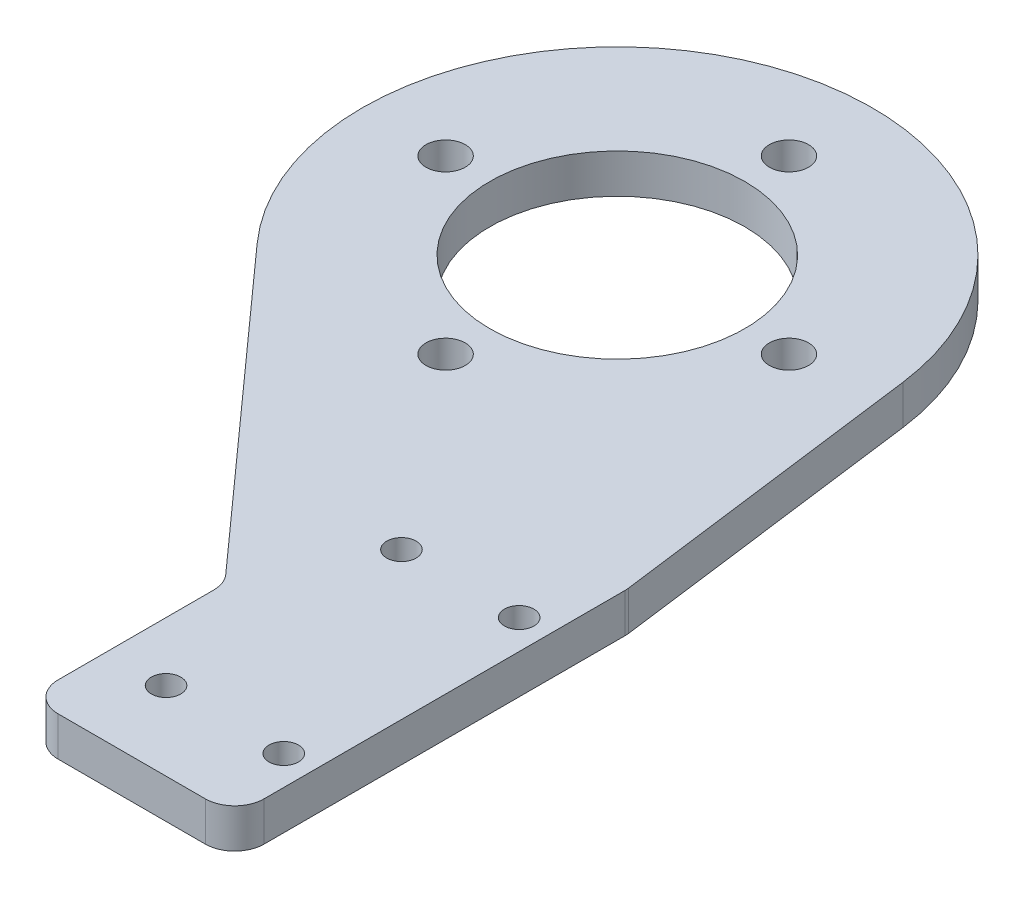
ISO-10303-21;
HEADER;
FILE_DESCRIPTION(('STEP AP214'),'2;1');
FILE_NAME('part.step','',(''),(''),'','','');
FILE_SCHEMA(('AUTOMOTIVE_DESIGN { 1 0 10303 214 1 1 1 1 }'));
ENDSEC;
DATA;
#1=APPLICATION_CONTEXT('core data for automotive mechanical design processes');
#2=APPLICATION_PROTOCOL_DEFINITION('international standard','automotive_design',2000,#1);
#3=PRODUCT_CONTEXT('',#1,'mechanical');
#4=PRODUCT('Part','Part','',(#3));
#5=PRODUCT_RELATED_PRODUCT_CATEGORY('part','',(#4));
#6=PRODUCT_DEFINITION_FORMATION('','',#4);
#7=PRODUCT_DEFINITION_CONTEXT('part definition',#1,'design');
#8=PRODUCT_DEFINITION('design','',#6,#7);
#9=PRODUCT_DEFINITION_SHAPE('','',#8);
#10=(LENGTH_UNIT() NAMED_UNIT(*) SI_UNIT(.MILLI.,.METRE.));
#11=(NAMED_UNIT(*) PLANE_ANGLE_UNIT() SI_UNIT($,.RADIAN.));
#12=(NAMED_UNIT(*) SI_UNIT($,.STERADIAN.) SOLID_ANGLE_UNIT());
#13=UNCERTAINTY_MEASURE_WITH_UNIT(LENGTH_MEASURE(1.E-05),#10,'distance_accuracy_value','');
#14=(GEOMETRIC_REPRESENTATION_CONTEXT(3) GLOBAL_UNCERTAINTY_ASSIGNED_CONTEXT((#13)) GLOBAL_UNIT_ASSIGNED_CONTEXT((#10,
#11,#12)) REPRESENTATION_CONTEXT('',''));
#15=CARTESIAN_POINT('',(0.,0.,0.));
#16=DIRECTION('',(0.,0.,1.));
#17=DIRECTION('',(1.,0.,0.));
#18=AXIS2_PLACEMENT_3D('',#15,#16,#17);
#19=CARTESIAN_POINT('',(-30.,4.,-69.));
#20=DIRECTION('',(0.,-1.,0.));
#21=DIRECTION('',(0.,0.,-1.));
#22=AXIS2_PLACEMENT_3D('',#19,#20,#21);
#23=CYLINDRICAL_SURFACE('',#22,26.);
#24=CARTESIAN_POINT('',(-30.,0.,-69.));
#25=DIRECTION('',(0.,1.,0.));
#26=DIRECTION('',(0.,0.,1.));
#27=AXIS2_PLACEMENT_3D('',#24,#25,#26);
#28=CIRCLE('',#27,26.);
#29=CARTESIAN_POINT('',(-4.21809841522244,0.,-72.3605878463216));
#30=VERTEX_POINT('',#29);
#31=CARTESIAN_POINT('',(-49.3623097548395,0.,-51.6477390246213));
#32=VERTEX_POINT('',#31);
#33=EDGE_CURVE('E148',#30,#32,#28,.T.);
#34=ORIENTED_EDGE('',*,*,#33,.T.);
#35=DIRECTION('',(0.,-1.,0.));
#36=VECTOR('',#35,1.);
#37=CARTESIAN_POINT('',(-49.3623097548395,4.,-51.6477390246213));
#38=LINE('',#37,#36);
#39=CARTESIAN_POINT('',(-49.3623097548395,4.,-51.6477390246213));
#40=VERTEX_POINT('',#39);
#41=EDGE_CURVE('E127',#40,#32,#38,.T.);
#42=ORIENTED_EDGE('',*,*,#41,.F.);
#43=CARTESIAN_POINT('',(-30.,4.,-69.));
#44=DIRECTION('',(0.,1.,0.));
#45=DIRECTION('',(0.,0.,1.));
#46=AXIS2_PLACEMENT_3D('',#43,#44,#45);
#47=CIRCLE('',#46,26.);
#48=CARTESIAN_POINT('',(-4.21809841522244,4.,-72.3605878463216));
#49=VERTEX_POINT('',#48);
#50=EDGE_CURVE('E135',#49,#40,#47,.T.);
#51=ORIENTED_EDGE('',*,*,#50,.F.);
#52=DIRECTION('',(0.,-1.,0.));
#53=VECTOR('',#52,1.);
#54=CARTESIAN_POINT('',(-4.21809841522244,4.,-72.3605878463216));
#55=LINE('',#54,#53);
#56=EDGE_CURVE('E146',#49,#30,#55,.T.);
#57=ORIENTED_EDGE('',*,*,#56,.T.);
#58=EDGE_LOOP('',(#34,#42,#51,#57));
#59=FACE_BOUND('',#58,.T.);
#60=ADVANCED_FACE('F43',(#59),#23,.T.);
#61=CARTESIAN_POINT('',(-1.70603961663828,4.,1.52893146722039));
#62=DIRECTION('',(-0.744704221339978,0.,0.66739465289918));
#63=DIRECTION('',(0.66739465289918,0.,0.744704221339978));
#64=AXIS2_PLACEMENT_3D('',#61,#62,#63);
#65=PLANE('',#64);
#66=DIRECTION('',(-0.66739465289918,0.,-0.744704221339978));
#67=VECTOR('',#66,1.);
#68=CARTESIAN_POINT('',(-1.70603961663828,0.,1.52893146722039));
#69=LINE('',#68,#67);
#70=CARTESIAN_POINT('',(-21.7658873359801,0.,-20.8546060860655));
#71=VERTEX_POINT('',#70);
#72=EDGE_CURVE('E188',#71,#32,#69,.T.);
#73=ORIENTED_EDGE('',*,*,#72,.F.);
#74=DIRECTION('',(0.,-1.,0.));
#75=VECTOR('',#74,1.);
#76=CARTESIAN_POINT('',(-21.7658873359801,4.,-20.8546060860655));
#77=LINE('',#76,#75);
#78=CARTESIAN_POINT('',(-21.7658873359801,4.,-20.8546060860655));
#79=VERTEX_POINT('',#78);
#80=EDGE_CURVE('E129',#71,#79,#77,.F.);
#81=ORIENTED_EDGE('',*,*,#80,.T.);
#82=DIRECTION('',(-0.66739465289918,0.,-0.744704221339978));
#83=VECTOR('',#82,1.);
#84=CARTESIAN_POINT('',(-1.70603961663828,4.,1.52893146722039));
#85=LINE('',#84,#83);
#86=EDGE_CURVE('E121',#79,#40,#85,.T.);
#87=ORIENTED_EDGE('',*,*,#86,.T.);
#88=ORIENTED_EDGE('',*,*,#41,.T.);
#89=EDGE_LOOP('',(#73,#81,#87,#88));
#90=FACE_BOUND('',#89,.T.);
#91=ADVANCED_FACE('F123',(#90),#65,.T.);
#92=CARTESIAN_POINT('',(-21.,4.,0.));
#93=DIRECTION('',(-1.,0.,0.));
#94=DIRECTION('',(0.,0.,1.));
#95=AXIS2_PLACEMENT_3D('',#92,#93,#94);
#96=PLANE('',#95);
#97=DIRECTION('',(0.,0.,-1.));
#98=VECTOR('',#97,1.);
#99=CARTESIAN_POINT('',(-21.,0.,0.));
#100=LINE('',#99,#98);
#101=CARTESIAN_POINT('',(-21.,0.,-3.));
#102=VERTEX_POINT('',#101);
#103=CARTESIAN_POINT('',(-21.,0.,-18.8524221273679));
#104=VERTEX_POINT('',#103);
#105=EDGE_CURVE('E186',#102,#104,#100,.T.);
#106=ORIENTED_EDGE('',*,*,#105,.F.);
#107=DIRECTION('',(0.,-1.,0.));
#108=VECTOR('',#107,1.);
#109=CARTESIAN_POINT('',(-21.,4.,-3.));
#110=LINE('',#109,#108);
#111=CARTESIAN_POINT('',(-21.,4.,-3.));
#112=VERTEX_POINT('',#111);
#113=EDGE_CURVE('E178',#102,#112,#110,.F.);
#114=ORIENTED_EDGE('',*,*,#113,.T.);
#115=DIRECTION('',(0.,0.,-1.));
#116=VECTOR('',#115,1.);
#117=CARTESIAN_POINT('',(-21.,4.,0.));
#118=LINE('',#117,#116);
#119=CARTESIAN_POINT('',(-21.,4.,-18.8524221273679));
#120=VERTEX_POINT('',#119);
#121=EDGE_CURVE('E133',#112,#120,#118,.T.);
#122=ORIENTED_EDGE('',*,*,#121,.T.);
#123=DIRECTION('',(0.,-1.,0.));
#124=VECTOR('',#123,1.);
#125=CARTESIAN_POINT('',(-21.,0.,-18.8524221273679));
#126=LINE('',#125,#124);
#127=EDGE_CURVE('E176',#120,#104,#126,.T.);
#128=ORIENTED_EDGE('',*,*,#127,.T.);
#129=EDGE_LOOP('',(#106,#114,#122,#128));
#130=FACE_BOUND('',#129,.T.);
#131=ADVANCED_FACE('F193',(#130),#96,.T.);
#132=CARTESIAN_POINT('',(0.,4.,0.));
#133=DIRECTION('',(0.,0.,1.));
#134=DIRECTION('',(1.,0.,0.));
#135=AXIS2_PLACEMENT_3D('',#132,#133,#134);
#136=PLANE('',#135);
#137=DIRECTION('',(-1.,0.,0.));
#138=VECTOR('',#137,1.);
#139=CARTESIAN_POINT('',(0.,0.,0.));
#140=LINE('',#139,#138);
#141=CARTESIAN_POINT('',(-3.,0.,0.));
#142=VERTEX_POINT('',#141);
#143=CARTESIAN_POINT('',(-18.,0.,0.));
#144=VERTEX_POINT('',#143);
#145=EDGE_CURVE('E220',#142,#144,#140,.T.);
#146=ORIENTED_EDGE('',*,*,#145,.F.);
#147=DIRECTION('',(0.,-1.,0.));
#148=VECTOR('',#147,1.);
#149=CARTESIAN_POINT('',(-3.,4.,0.));
#150=LINE('',#149,#148);
#151=CARTESIAN_POINT('',(-3.,4.,0.));
#152=VERTEX_POINT('',#151);
#153=EDGE_CURVE('E62',#142,#152,#150,.F.);
#154=ORIENTED_EDGE('',*,*,#153,.T.);
#155=DIRECTION('',(-1.,0.,0.));
#156=VECTOR('',#155,1.);
#157=CARTESIAN_POINT('',(0.,4.,0.));
#158=LINE('',#157,#156);
#159=CARTESIAN_POINT('',(-18.,4.,0.));
#160=VERTEX_POINT('',#159);
#161=EDGE_CURVE('E198',#152,#160,#158,.T.);
#162=ORIENTED_EDGE('',*,*,#161,.T.);
#163=DIRECTION('',(0.,-1.,0.));
#164=VECTOR('',#163,1.);
#165=CARTESIAN_POINT('',(-18.,4.,0.));
#166=LINE('',#165,#164);
#167=EDGE_CURVE('E175',#160,#144,#166,.T.);
#168=ORIENTED_EDGE('',*,*,#167,.T.);
#169=EDGE_LOOP('',(#146,#154,#162,#168));
#170=FACE_BOUND('',#169,.T.);
#171=ADVANCED_FACE('F276',(#170),#136,.T.);
#172=CARTESIAN_POINT('',(0.,4.,0.));
#173=DIRECTION('',(-1.,0.,0.));
#174=DIRECTION('',(0.,0.,1.));
#175=AXIS2_PLACEMENT_3D('',#172,#173,#174);
#176=PLANE('',#175);
#177=DIRECTION('',(0.,0.,-1.));
#178=VECTOR('',#177,1.);
#179=CARTESIAN_POINT('',(0.,0.,0.));
#180=LINE('',#179,#178);
#181=CARTESIAN_POINT('',(0.,0.,-3.));
#182=VERTEX_POINT('',#181);
#183=CARTESIAN_POINT('',(0.,0.,-39.8053033351342));
#184=VERTEX_POINT('',#183);
#185=EDGE_CURVE('E219',#182,#184,#180,.T.);
#186=ORIENTED_EDGE('',*,*,#185,.T.);
#187=DIRECTION('',(0.,-1.,0.));
#188=VECTOR('',#187,1.);
#189=CARTESIAN_POINT('',(0.,4.,-39.8053033351342));
#190=LINE('',#189,#188);
#191=CARTESIAN_POINT('',(0.,4.,-39.8053033351342));
#192=VERTEX_POINT('',#191);
#193=EDGE_CURVE('E164',#184,#192,#190,.F.);
#194=ORIENTED_EDGE('',*,*,#193,.T.);
#195=DIRECTION('',(0.,0.,-1.));
#196=VECTOR('',#195,1.);
#197=CARTESIAN_POINT('',(0.,4.,0.));
#198=LINE('',#197,#196);
#199=CARTESIAN_POINT('',(0.,4.,-3.));
#200=VERTEX_POINT('',#199);
#201=EDGE_CURVE('E196',#200,#192,#198,.T.);
#202=ORIENTED_EDGE('',*,*,#201,.F.);
#203=DIRECTION('',(0.,-1.,0.));
#204=VECTOR('',#203,1.);
#205=CARTESIAN_POINT('',(0.,0.,-3.));
#206=LINE('',#205,#204);
#207=EDGE_CURVE('E165',#200,#182,#206,.T.);
#208=ORIENTED_EDGE('',*,*,#207,.T.);
#209=EDGE_LOOP('',(#186,#194,#202,#208));
#210=FACE_BOUND('',#209,.T.);
#211=ADVANCED_FACE('F282',(#210),#176,.F.);
#212=CARTESIAN_POINT('',(-3.,4.,-32.));
#213=DIRECTION('',(0.,-1.,0.));
#214=DIRECTION('',(0.,0.,-1.));
#215=AXIS2_PLACEMENT_3D('',#212,#213,#214);
#216=CYLINDRICAL_SURFACE('',#215,1.5);
#217=CARTESIAN_POINT('',(-3.,4.,-32.));
#218=DIRECTION('',(0.,1.,0.));
#219=DIRECTION('',(0.,0.,1.));
#220=AXIS2_PLACEMENT_3D('',#217,#218,#219);
#221=CIRCLE('',#220,1.5);
#222=CARTESIAN_POINT('',(-3.,4.,-30.5));
#223=VERTEX_POINT('',#222);
#224=EDGE_CURVE('E207',#223,#223,#221,.T.);
#225=ORIENTED_EDGE('',*,*,#224,.T.);
#226=EDGE_LOOP('',(#225));
#227=FACE_BOUND('',#226,.T.);
#228=CARTESIAN_POINT('',(-3.,0.,-32.));
#229=DIRECTION('',(0.,1.,0.));
#230=DIRECTION('',(0.,0.,1.));
#231=AXIS2_PLACEMENT_3D('',#228,#229,#230);
#232=CIRCLE('',#231,1.5);
#233=CARTESIAN_POINT('',(-3.,0.,-30.5));
#234=VERTEX_POINT('',#233);
#235=EDGE_CURVE('E231',#234,#234,#232,.T.);
#236=ORIENTED_EDGE('',*,*,#235,.F.);
#237=EDGE_LOOP('',(#236));
#238=FACE_BOUND('',#237,.T.);
#239=ADVANCED_FACE('F289',(#227,#238),#216,.F.);
#240=CARTESIAN_POINT('',(-2.99999999999975,4.,-8.));
#241=DIRECTION('',(0.,-1.,0.));
#242=DIRECTION('',(0.,0.,-1.));
#243=AXIS2_PLACEMENT_3D('',#240,#241,#242);
#244=CYLINDRICAL_SURFACE('',#243,1.5);
#245=CARTESIAN_POINT('',(-2.99999999999975,4.,-8.));
#246=DIRECTION('',(0.,1.,0.));
#247=DIRECTION('',(0.,0.,1.));
#248=AXIS2_PLACEMENT_3D('',#245,#246,#247);
#249=CIRCLE('',#248,1.5);
#250=CARTESIAN_POINT('',(-2.99999999999975,4.,-6.5));
#251=VERTEX_POINT('',#250);
#252=EDGE_CURVE('E206',#251,#251,#249,.T.);
#253=ORIENTED_EDGE('',*,*,#252,.T.);
#254=EDGE_LOOP('',(#253));
#255=FACE_BOUND('',#254,.T.);
#256=CARTESIAN_POINT('',(-2.99999999999975,0.,-8.));
#257=DIRECTION('',(0.,1.,0.));
#258=DIRECTION('',(0.,0.,1.));
#259=AXIS2_PLACEMENT_3D('',#256,#257,#258);
#260=CIRCLE('',#259,1.5);
#261=CARTESIAN_POINT('',(-2.99999999999975,0.,-6.5));
#262=VERTEX_POINT('',#261);
#263=EDGE_CURVE('E226',#262,#262,#260,.T.);
#264=ORIENTED_EDGE('',*,*,#263,.F.);
#265=EDGE_LOOP('',(#264));
#266=FACE_BOUND('',#265,.T.);
#267=ADVANCED_FACE('F293',(#255,#266),#244,.F.);
#268=CARTESIAN_POINT('',(-14.9999999999997,4.,-8.));
#269=DIRECTION('',(0.,-1.,0.));
#270=DIRECTION('',(0.,0.,-1.));
#271=AXIS2_PLACEMENT_3D('',#268,#269,#270);
#272=CYLINDRICAL_SURFACE('',#271,1.5);
#273=CARTESIAN_POINT('',(-14.9999999999997,4.,-8.));
#274=DIRECTION('',(0.,1.,0.));
#275=DIRECTION('',(0.,0.,1.));
#276=AXIS2_PLACEMENT_3D('',#273,#274,#275);
#277=CIRCLE('',#276,1.5);
#278=CARTESIAN_POINT('',(-14.9999999999997,4.,-6.5));
#279=VERTEX_POINT('',#278);
#280=EDGE_CURVE('E201',#279,#279,#277,.T.);
#281=ORIENTED_EDGE('',*,*,#280,.T.);
#282=EDGE_LOOP('',(#281));
#283=FACE_BOUND('',#282,.T.);
#284=CARTESIAN_POINT('',(-14.9999999999997,0.,-8.));
#285=DIRECTION('',(0.,1.,0.));
#286=DIRECTION('',(0.,0.,1.));
#287=AXIS2_PLACEMENT_3D('',#284,#285,#286);
#288=CIRCLE('',#287,1.5);
#289=CARTESIAN_POINT('',(-14.9999999999997,0.,-6.5));
#290=VERTEX_POINT('',#289);
#291=EDGE_CURVE('E223',#290,#290,#288,.T.);
#292=ORIENTED_EDGE('',*,*,#291,.F.);
#293=EDGE_LOOP('',(#292));
#294=FACE_BOUND('',#293,.T.);
#295=ADVANCED_FACE('F249',(#283,#294),#272,.F.);
#296=CARTESIAN_POINT('',(5.12676598348304,4.,-0.668257436262989));
#297=DIRECTION('',(-0.991611599414522,0.,0.129253378704677));
#298=DIRECTION('',(0.129253378704677,0.,0.991611599414521));
#299=AXIS2_PLACEMENT_3D('',#296,#297,#298);
#300=PLANE('',#299);
#301=DIRECTION('',(-0.129253378704677,0.,-0.991611599414522));
#302=VECTOR('',#301,1.);
#303=CARTESIAN_POINT('',(5.12676598348304,4.,-0.668257436262989));
#304=LINE('',#303,#302);
#305=CARTESIAN_POINT('',(-0.0251652017564368,4.,-40.1930634712483));
#306=VERTEX_POINT('',#305);
#307=EDGE_CURVE('E138',#306,#49,#304,.T.);
#308=ORIENTED_EDGE('',*,*,#307,.F.);
#309=DIRECTION('',(0.,-1.,0.));
#310=VECTOR('',#309,1.);
#311=CARTESIAN_POINT('',(-0.0251652017564351,4.,-40.1930634712482));
#312=LINE('',#311,#310);
#313=CARTESIAN_POINT('',(-0.0251652017564368,0.,-40.1930634712483));
#314=VERTEX_POINT('',#313);
#315=EDGE_CURVE('E150',#306,#314,#312,.T.);
#316=ORIENTED_EDGE('',*,*,#315,.T.);
#317=DIRECTION('',(-0.129253378704677,0.,-0.991611599414522));
#318=VECTOR('',#317,1.);
#319=CARTESIAN_POINT('',(5.12676598348304,0.,-0.668257436262989));
#320=LINE('',#319,#318);
#321=EDGE_CURVE('E224',#314,#30,#320,.T.);
#322=ORIENTED_EDGE('',*,*,#321,.T.);
#323=ORIENTED_EDGE('',*,*,#56,.F.);
#324=EDGE_LOOP('',(#308,#316,#322,#323));
#325=FACE_BOUND('',#324,.T.);
#326=ADVANCED_FACE('F238',(#325),#300,.F.);
#327=CARTESIAN_POINT('',(-15.,4.,-32.));
#328=DIRECTION('',(0.,-1.,0.));
#329=DIRECTION('',(0.,0.,-1.));
#330=AXIS2_PLACEMENT_3D('',#327,#328,#329);
#331=CYLINDRICAL_SURFACE('',#330,1.5);
#332=CARTESIAN_POINT('',(-15.,4.,-32.));
#333=DIRECTION('',(0.,1.,0.));
#334=DIRECTION('',(0.,0.,1.));
#335=AXIS2_PLACEMENT_3D('',#332,#333,#334);
#336=CIRCLE('',#335,1.5);
#337=CARTESIAN_POINT('',(-15.,4.,-30.5));
#338=VERTEX_POINT('',#337);
#339=EDGE_CURVE('E153',#338,#338,#336,.T.);
#340=ORIENTED_EDGE('',*,*,#339,.T.);
#341=EDGE_LOOP('',(#340));
#342=FACE_BOUND('',#341,.T.);
#343=CARTESIAN_POINT('',(-15.,0.,-32.));
#344=DIRECTION('',(0.,1.,0.));
#345=DIRECTION('',(0.,0.,1.));
#346=AXIS2_PLACEMENT_3D('',#343,#344,#345);
#347=CIRCLE('',#346,1.5);
#348=CARTESIAN_POINT('',(-15.,0.,-30.5));
#349=VERTEX_POINT('',#348);
#350=EDGE_CURVE('E141',#349,#349,#347,.T.);
#351=ORIENTED_EDGE('',*,*,#350,.F.);
#352=EDGE_LOOP('',(#351));
#353=FACE_BOUND('',#352,.T.);
#354=ADVANCED_FACE('F236',(#342,#353),#331,.F.);
#355=CARTESIAN_POINT('',(0.,4.,0.));
#356=DIRECTION('',(0.,1.,0.));
#357=DIRECTION('',(0.,0.,1.));
#358=AXIS2_PLACEMENT_3D('',#355,#356,#357);
#359=PLANE('',#358);
#360=ORIENTED_EDGE('',*,*,#201,.T.);
#361=CARTESIAN_POINT('',(-3.,4.,-39.8053033351342));
#362=DIRECTION('',(0.,1.,0.));
#363=DIRECTION('',(0.,0.,1.));
#364=AXIS2_PLACEMENT_3D('',#361,#362,#363);
#365=CIRCLE('',#364,3.);
#366=EDGE_CURVE('E168',#192,#306,#365,.T.);
#367=ORIENTED_EDGE('',*,*,#366,.T.);
#368=ORIENTED_EDGE('',*,*,#307,.T.);
#369=ORIENTED_EDGE('',*,*,#50,.T.);
#370=ORIENTED_EDGE('',*,*,#86,.F.);
#371=CARTESIAN_POINT('',(-24.,4.,-18.8524221273679));
#372=DIRECTION('',(0.,1.,0.));
#373=DIRECTION('',(0.,0.,1.));
#374=AXIS2_PLACEMENT_3D('',#371,#372,#373);
#375=CIRCLE('',#374,3.);
#376=EDGE_CURVE('E11',#79,#120,#375,.F.);
#377=ORIENTED_EDGE('',*,*,#376,.T.);
#378=ORIENTED_EDGE('',*,*,#121,.F.);
#379=CARTESIAN_POINT('',(-18.,4.,-3.));
#380=DIRECTION('',(0.,1.,0.));
#381=DIRECTION('',(0.,0.,1.));
#382=AXIS2_PLACEMENT_3D('',#379,#380,#381);
#383=CIRCLE('',#382,3.);
#384=EDGE_CURVE('E59',#112,#160,#383,.T.);
#385=ORIENTED_EDGE('',*,*,#384,.T.);
#386=ORIENTED_EDGE('',*,*,#161,.F.);
#387=CARTESIAN_POINT('',(-3.,4.,-3.));
#388=DIRECTION('',(0.,1.,0.));
#389=DIRECTION('',(0.,0.,1.));
#390=AXIS2_PLACEMENT_3D('',#387,#388,#389);
#391=CIRCLE('',#390,3.);
#392=EDGE_CURVE('E169',#152,#200,#391,.T.);
#393=ORIENTED_EDGE('',*,*,#392,.T.);
#394=EDGE_LOOP('',(#360,#367,#368,#369,#370,#377,#378,#385,#386,#393));
#395=FACE_BOUND('',#394,.T.);
#396=ORIENTED_EDGE('',*,*,#280,.F.);
#397=EDGE_LOOP('',(#396));
#398=FACE_BOUND('',#397,.T.);
#399=ORIENTED_EDGE('',*,*,#252,.F.);
#400=EDGE_LOOP('',(#399));
#401=FACE_BOUND('',#400,.T.);
#402=ORIENTED_EDGE('',*,*,#224,.F.);
#403=EDGE_LOOP('',(#402));
#404=FACE_BOUND('',#403,.T.);
#405=ORIENTED_EDGE('',*,*,#339,.F.);
#406=EDGE_LOOP('',(#405));
#407=FACE_BOUND('',#406,.T.);
#408=CARTESIAN_POINT('',(-29.9999999999998,4.,-86.5));
#409=DIRECTION('',(0.,1.,0.));
#410=DIRECTION('',(0.,0.,1.));
#411=AXIS2_PLACEMENT_3D('',#408,#409,#410);
#412=CIRCLE('',#411,1.99999999999999);
#413=CARTESIAN_POINT('',(-29.9999999999998,4.,-84.5));
#414=VERTEX_POINT('',#413);
#415=EDGE_CURVE('E454',#414,#414,#412,.T.);
#416=ORIENTED_EDGE('',*,*,#415,.F.);
#417=EDGE_LOOP('',(#416));
#418=FACE_BOUND('',#417,.T.);
#419=CARTESIAN_POINT('',(-47.5,4.,-69.0000000000001));
#420=DIRECTION('',(0.,1.,0.));
#421=DIRECTION('',(0.,0.,1.));
#422=AXIS2_PLACEMENT_3D('',#419,#420,#421);
#423=CIRCLE('',#422,1.99999999999999);
#424=CARTESIAN_POINT('',(-47.5,4.,-67.0000000000002));
#425=VERTEX_POINT('',#424);
#426=EDGE_CURVE('E456',#425,#425,#423,.T.);
#427=ORIENTED_EDGE('',*,*,#426,.F.);
#428=EDGE_LOOP('',(#427));
#429=FACE_BOUND('',#428,.T.);
#430=CARTESIAN_POINT('',(-30.0000000000001,4.,-51.5));
#431=DIRECTION('',(0.,1.,0.));
#432=DIRECTION('',(0.,0.,1.));
#433=AXIS2_PLACEMENT_3D('',#430,#431,#432);
#434=CIRCLE('',#433,2.);
#435=CARTESIAN_POINT('',(-30.0000000000001,4.,-49.5));
#436=VERTEX_POINT('',#435);
#437=EDGE_CURVE('E464',#436,#436,#434,.T.);
#438=ORIENTED_EDGE('',*,*,#437,.F.);
#439=EDGE_LOOP('',(#438));
#440=FACE_BOUND('',#439,.T.);
#441=CARTESIAN_POINT('',(-12.5,4.,-69.));
#442=DIRECTION('',(0.,1.,0.));
#443=DIRECTION('',(0.,0.,1.));
#444=AXIS2_PLACEMENT_3D('',#441,#442,#443);
#445=CIRCLE('',#444,2.);
#446=CARTESIAN_POINT('',(-12.5,4.,-67.));
#447=VERTEX_POINT('',#446);
#448=EDGE_CURVE('E469',#447,#447,#445,.T.);
#449=ORIENTED_EDGE('',*,*,#448,.F.);
#450=EDGE_LOOP('',(#449));
#451=FACE_BOUND('',#450,.T.);
#452=CARTESIAN_POINT('',(-30.,4.,-69.));
#453=DIRECTION('',(0.,1.,0.));
#454=DIRECTION('',(0.,0.,1.));
#455=AXIS2_PLACEMENT_3D('',#452,#453,#454);
#456=CIRCLE('',#455,13.);
#457=CARTESIAN_POINT('',(-30.,4.,-56.));
#458=VERTEX_POINT('',#457);
#459=EDGE_CURVE('E478',#458,#458,#456,.T.);
#460=ORIENTED_EDGE('',*,*,#459,.F.);
#461=EDGE_LOOP('',(#460));
#462=FACE_BOUND('',#461,.T.);
#463=ADVANCED_FACE('F136',(#395,#398,#401,#404,#407,#418,#429,#440,#451,#462),#359,.T.);
#464=CARTESIAN_POINT('',(0.,0.,0.));
#465=DIRECTION('',(0.,1.,0.));
#466=DIRECTION('',(0.,0.,1.));
#467=AXIS2_PLACEMENT_3D('',#464,#465,#466);
#468=PLANE('',#467);
#469=ORIENTED_EDGE('',*,*,#321,.F.);
#470=CARTESIAN_POINT('',(-3.,0.,-39.8053033351342));
#471=DIRECTION('',(0.,1.,0.));
#472=DIRECTION('',(0.,0.,1.));
#473=AXIS2_PLACEMENT_3D('',#470,#471,#472);
#474=CIRCLE('',#473,3.);
#475=EDGE_CURVE('E159',#314,#184,#474,.F.);
#476=ORIENTED_EDGE('',*,*,#475,.T.);
#477=ORIENTED_EDGE('',*,*,#185,.F.);
#478=CARTESIAN_POINT('',(-3.,0.,-3.));
#479=DIRECTION('',(0.,1.,0.));
#480=DIRECTION('',(0.,0.,1.));
#481=AXIS2_PLACEMENT_3D('',#478,#479,#480);
#482=CIRCLE('',#481,3.);
#483=EDGE_CURVE('E158',#182,#142,#482,.F.);
#484=ORIENTED_EDGE('',*,*,#483,.T.);
#485=ORIENTED_EDGE('',*,*,#145,.T.);
#486=CARTESIAN_POINT('',(-18.,0.,-3.));
#487=DIRECTION('',(0.,1.,0.));
#488=DIRECTION('',(0.,0.,1.));
#489=AXIS2_PLACEMENT_3D('',#486,#487,#488);
#490=CIRCLE('',#489,3.);
#491=EDGE_CURVE('E151',#144,#102,#490,.F.);
#492=ORIENTED_EDGE('',*,*,#491,.T.);
#493=ORIENTED_EDGE('',*,*,#105,.T.);
#494=CARTESIAN_POINT('',(-24.,0.,-18.8524221273679));
#495=DIRECTION('',(0.,1.,0.));
#496=DIRECTION('',(0.,0.,1.));
#497=AXIS2_PLACEMENT_3D('',#494,#495,#496);
#498=CIRCLE('',#497,3.);
#499=EDGE_CURVE('E51',#104,#71,#498,.T.);
#500=ORIENTED_EDGE('',*,*,#499,.T.);
#501=ORIENTED_EDGE('',*,*,#72,.T.);
#502=ORIENTED_EDGE('',*,*,#33,.F.);
#503=EDGE_LOOP('',(#469,#476,#477,#484,#485,#492,#493,#500,#501,#502));
#504=FACE_BOUND('',#503,.T.);
#505=ORIENTED_EDGE('',*,*,#291,.T.);
#506=EDGE_LOOP('',(#505));
#507=FACE_BOUND('',#506,.T.);
#508=ORIENTED_EDGE('',*,*,#263,.T.);
#509=EDGE_LOOP('',(#508));
#510=FACE_BOUND('',#509,.T.);
#511=ORIENTED_EDGE('',*,*,#235,.T.);
#512=EDGE_LOOP('',(#511));
#513=FACE_BOUND('',#512,.T.);
#514=ORIENTED_EDGE('',*,*,#350,.T.);
#515=EDGE_LOOP('',(#514));
#516=FACE_BOUND('',#515,.T.);
#517=CARTESIAN_POINT('',(-29.9999999999998,0.,-86.5));
#518=DIRECTION('',(0.,1.,0.));
#519=DIRECTION('',(0.,0.,1.));
#520=AXIS2_PLACEMENT_3D('',#517,#518,#519);
#521=CIRCLE('',#520,1.99999999999999);
#522=CARTESIAN_POINT('',(-29.9999999999998,0.,-84.5));
#523=VERTEX_POINT('',#522);
#524=EDGE_CURVE('E455',#523,#523,#521,.T.);
#525=ORIENTED_EDGE('',*,*,#524,.T.);
#526=EDGE_LOOP('',(#525));
#527=FACE_BOUND('',#526,.T.);
#528=CARTESIAN_POINT('',(-47.5,0.,-69.0000000000001));
#529=DIRECTION('',(0.,1.,0.));
#530=DIRECTION('',(0.,0.,1.));
#531=AXIS2_PLACEMENT_3D('',#528,#529,#530);
#532=CIRCLE('',#531,1.99999999999999);
#533=CARTESIAN_POINT('',(-47.5,0.,-67.0000000000002));
#534=VERTEX_POINT('',#533);
#535=EDGE_CURVE('E463',#534,#534,#532,.T.);
#536=ORIENTED_EDGE('',*,*,#535,.T.);
#537=EDGE_LOOP('',(#536));
#538=FACE_BOUND('',#537,.T.);
#539=CARTESIAN_POINT('',(-30.0000000000001,0.,-51.5));
#540=DIRECTION('',(0.,1.,0.));
#541=DIRECTION('',(0.,0.,1.));
#542=AXIS2_PLACEMENT_3D('',#539,#540,#541);
#543=CIRCLE('',#542,2.);
#544=CARTESIAN_POINT('',(-30.0000000000001,0.,-49.5));
#545=VERTEX_POINT('',#544);
#546=EDGE_CURVE('E470',#545,#545,#543,.T.);
#547=ORIENTED_EDGE('',*,*,#546,.T.);
#548=EDGE_LOOP('',(#547));
#549=FACE_BOUND('',#548,.T.);
#550=CARTESIAN_POINT('',(-12.5,0.,-69.));
#551=DIRECTION('',(0.,1.,0.));
#552=DIRECTION('',(0.,0.,1.));
#553=AXIS2_PLACEMENT_3D('',#550,#551,#552);
#554=CIRCLE('',#553,2.);
#555=CARTESIAN_POINT('',(-12.5,0.,-67.));
#556=VERTEX_POINT('',#555);
#557=EDGE_CURVE('E471',#556,#556,#554,.T.);
#558=ORIENTED_EDGE('',*,*,#557,.T.);
#559=EDGE_LOOP('',(#558));
#560=FACE_BOUND('',#559,.T.);
#561=CARTESIAN_POINT('',(-30.,0.,-69.));
#562=DIRECTION('',(0.,1.,0.));
#563=DIRECTION('',(0.,0.,1.));
#564=AXIS2_PLACEMENT_3D('',#561,#562,#563);
#565=CIRCLE('',#564,13.);
#566=CARTESIAN_POINT('',(-30.,0.,-56.));
#567=VERTEX_POINT('',#566);
#568=EDGE_CURVE('E212',#567,#567,#565,.T.);
#569=ORIENTED_EDGE('',*,*,#568,.T.);
#570=EDGE_LOOP('',(#569));
#571=FACE_BOUND('',#570,.T.);
#572=ADVANCED_FACE('F184',(#504,#507,#510,#513,#516,#527,#538,#549,#560,#571),#468,.F.);
#573=CARTESIAN_POINT('',(-30.,0.,-69.));
#574=DIRECTION('',(0.,1.,0.));
#575=DIRECTION('',(0.,0.,1.));
#576=AXIS2_PLACEMENT_3D('',#573,#574,#575);
#577=CYLINDRICAL_SURFACE('',#576,13.);
#578=ORIENTED_EDGE('',*,*,#568,.F.);
#579=EDGE_LOOP('',(#578));
#580=FACE_BOUND('',#579,.T.);
#581=ORIENTED_EDGE('',*,*,#459,.T.);
#582=EDGE_LOOP('',(#581));
#583=FACE_BOUND('',#582,.T.);
#584=ADVANCED_FACE('F375',(#580,#583),#577,.F.);
#585=CARTESIAN_POINT('',(-12.5,0.,-69.));
#586=DIRECTION('',(0.,1.,0.));
#587=DIRECTION('',(0.,0.,1.));
#588=AXIS2_PLACEMENT_3D('',#585,#586,#587);
#589=CYLINDRICAL_SURFACE('',#588,2.);
#590=ORIENTED_EDGE('',*,*,#557,.F.);
#591=EDGE_LOOP('',(#590));
#592=FACE_BOUND('',#591,.T.);
#593=ORIENTED_EDGE('',*,*,#448,.T.);
#594=EDGE_LOOP('',(#593));
#595=FACE_BOUND('',#594,.T.);
#596=ADVANCED_FACE('F387',(#592,#595),#589,.F.);
#597=CARTESIAN_POINT('',(-30.0000000000001,0.,-51.5));
#598=DIRECTION('',(0.,1.,0.));
#599=DIRECTION('',(0.,0.,1.));
#600=AXIS2_PLACEMENT_3D('',#597,#598,#599);
#601=CYLINDRICAL_SURFACE('',#600,2.);
#602=ORIENTED_EDGE('',*,*,#546,.F.);
#603=EDGE_LOOP('',(#602));
#604=FACE_BOUND('',#603,.T.);
#605=ORIENTED_EDGE('',*,*,#437,.T.);
#606=EDGE_LOOP('',(#605));
#607=FACE_BOUND('',#606,.T.);
#608=ADVANCED_FACE('F396',(#604,#607),#601,.F.);
#609=CARTESIAN_POINT('',(-47.5,0.,-69.0000000000001));
#610=DIRECTION('',(0.,1.,0.));
#611=DIRECTION('',(0.,0.,1.));
#612=AXIS2_PLACEMENT_3D('',#609,#610,#611);
#613=CYLINDRICAL_SURFACE('',#612,1.99999999999999);
#614=ORIENTED_EDGE('',*,*,#535,.F.);
#615=EDGE_LOOP('',(#614));
#616=FACE_BOUND('',#615,.T.);
#617=ORIENTED_EDGE('',*,*,#426,.T.);
#618=EDGE_LOOP('',(#617));
#619=FACE_BOUND('',#618,.T.);
#620=ADVANCED_FACE('F408',(#616,#619),#613,.F.);
#621=CARTESIAN_POINT('',(-29.9999999999998,0.,-86.5));
#622=DIRECTION('',(0.,1.,0.));
#623=DIRECTION('',(0.,0.,1.));
#624=AXIS2_PLACEMENT_3D('',#621,#622,#623);
#625=CYLINDRICAL_SURFACE('',#624,1.99999999999999);
#626=ORIENTED_EDGE('',*,*,#524,.F.);
#627=EDGE_LOOP('',(#626));
#628=FACE_BOUND('',#627,.T.);
#629=ORIENTED_EDGE('',*,*,#415,.T.);
#630=EDGE_LOOP('',(#629));
#631=FACE_BOUND('',#630,.T.);
#632=ADVANCED_FACE('F268',(#628,#631),#625,.F.);
#633=CARTESIAN_POINT('',(-3.,4.,-39.8053033351342));
#634=DIRECTION('',(0.,-1.,0.));
#635=DIRECTION('',(0.,0.,-1.));
#636=AXIS2_PLACEMENT_3D('',#633,#634,#635);
#637=CYLINDRICAL_SURFACE('',#636,3.);
#638=ORIENTED_EDGE('',*,*,#366,.F.);
#639=ORIENTED_EDGE('',*,*,#193,.F.);
#640=ORIENTED_EDGE('',*,*,#475,.F.);
#641=ORIENTED_EDGE('',*,*,#315,.F.);
#642=EDGE_LOOP('',(#638,#639,#640,#641));
#643=FACE_BOUND('',#642,.T.);
#644=ADVANCED_FACE('F262',(#643),#637,.T.);
#645=CARTESIAN_POINT('',(-3.,4.,-3.));
#646=DIRECTION('',(0.,1.,0.));
#647=DIRECTION('',(0.,0.,1.));
#648=AXIS2_PLACEMENT_3D('',#645,#646,#647);
#649=CYLINDRICAL_SURFACE('',#648,3.);
#650=ORIENTED_EDGE('',*,*,#392,.F.);
#651=ORIENTED_EDGE('',*,*,#153,.F.);
#652=ORIENTED_EDGE('',*,*,#483,.F.);
#653=ORIENTED_EDGE('',*,*,#207,.F.);
#654=EDGE_LOOP('',(#650,#651,#652,#653));
#655=FACE_BOUND('',#654,.T.);
#656=ADVANCED_FACE('F270',(#655),#649,.T.);
#657=CARTESIAN_POINT('',(-18.,4.,-3.));
#658=DIRECTION('',(0.,-1.,0.));
#659=DIRECTION('',(0.,0.,-1.));
#660=AXIS2_PLACEMENT_3D('',#657,#658,#659);
#661=CYLINDRICAL_SURFACE('',#660,3.);
#662=ORIENTED_EDGE('',*,*,#384,.F.);
#663=ORIENTED_EDGE('',*,*,#113,.F.);
#664=ORIENTED_EDGE('',*,*,#491,.F.);
#665=ORIENTED_EDGE('',*,*,#167,.F.);
#666=EDGE_LOOP('',(#662,#663,#664,#665));
#667=FACE_BOUND('',#666,.T.);
#668=ADVANCED_FACE('F271',(#667),#661,.T.);
#669=CARTESIAN_POINT('',(-24.,4.,-18.8524221273679));
#670=DIRECTION('',(0.,1.,0.));
#671=DIRECTION('',(0.,0.,1.));
#672=AXIS2_PLACEMENT_3D('',#669,#670,#671);
#673=CYLINDRICAL_SURFACE('',#672,3.);
#674=ORIENTED_EDGE('',*,*,#376,.F.);
#675=ORIENTED_EDGE('',*,*,#80,.F.);
#676=ORIENTED_EDGE('',*,*,#499,.F.);
#677=ORIENTED_EDGE('',*,*,#127,.F.);
#678=EDGE_LOOP('',(#674,#675,#676,#677));
#679=FACE_BOUND('',#678,.T.);
#680=ADVANCED_FACE('F44',(#679),#673,.F.);
#681=CLOSED_SHELL('',(#60,#91,#131,#171,#211,#239,#267,#295,#326,#354,#463,#572,#584,#596,#608,
#620,#632,#644,#656,#668,#680));
#682=MANIFOLD_SOLID_BREP('B2',#681);
#683=ADVANCED_BREP_SHAPE_REPRESENTATION('',(#18,#682),#14);
#684=SHAPE_DEFINITION_REPRESENTATION(#9,#683);
ENDSEC;
END-ISO-10303-21;
